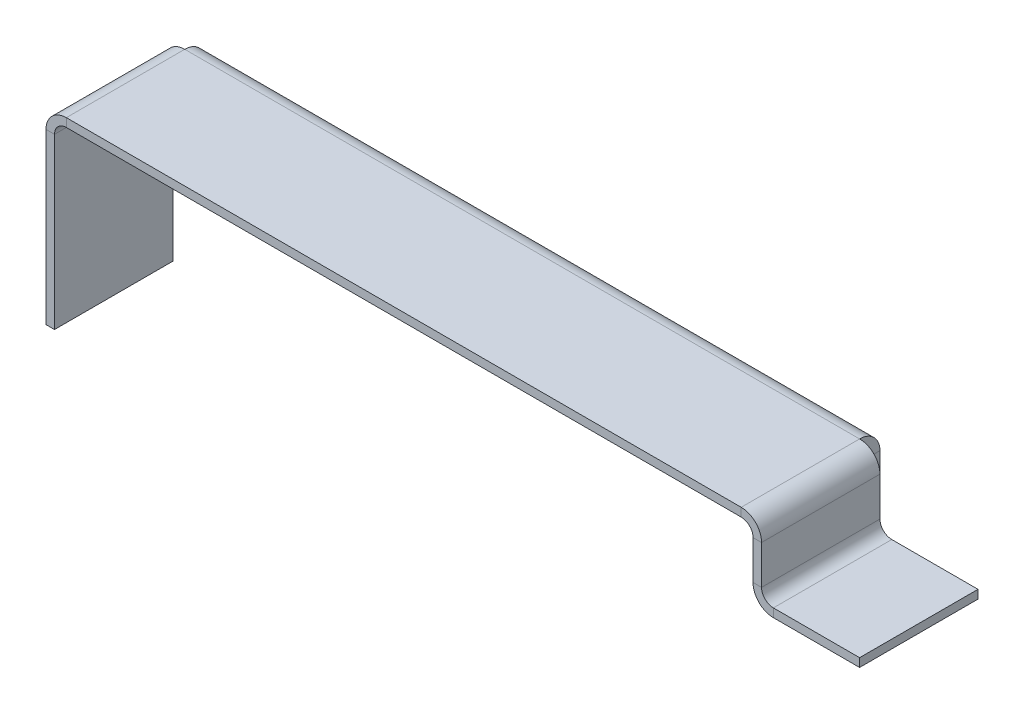
ISO-10303-21;
HEADER;
FILE_DESCRIPTION(('STEP AP214'),'2;1');
FILE_NAME('part.step','',(''),(''),'','','');
FILE_SCHEMA(('AUTOMOTIVE_DESIGN { 1 0 10303 214 1 1 1 1 }'));
ENDSEC;
DATA;
#1=APPLICATION_CONTEXT('core data for automotive mechanical design processes');
#2=APPLICATION_PROTOCOL_DEFINITION('international standard','automotive_design',2000,#1);
#3=PRODUCT_CONTEXT('',#1,'mechanical');
#4=PRODUCT('Part','Part','',(#3));
#5=PRODUCT_RELATED_PRODUCT_CATEGORY('part','',(#4));
#6=PRODUCT_DEFINITION_FORMATION('','',#4);
#7=PRODUCT_DEFINITION_CONTEXT('part definition',#1,'design');
#8=PRODUCT_DEFINITION('design','',#6,#7);
#9=PRODUCT_DEFINITION_SHAPE('','',#8);
#10=(LENGTH_UNIT() NAMED_UNIT(*) SI_UNIT(.MILLI.,.METRE.));
#11=(NAMED_UNIT(*) PLANE_ANGLE_UNIT() SI_UNIT($,.RADIAN.));
#12=(NAMED_UNIT(*) SI_UNIT($,.STERADIAN.) SOLID_ANGLE_UNIT());
#13=UNCERTAINTY_MEASURE_WITH_UNIT(LENGTH_MEASURE(1.E-05),#10,'distance_accuracy_value','');
#14=(GEOMETRIC_REPRESENTATION_CONTEXT(3) GLOBAL_UNCERTAINTY_ASSIGNED_CONTEXT((#13)) GLOBAL_UNIT_ASSIGNED_CONTEXT((#10,
#11,#12)) REPRESENTATION_CONTEXT('',''));
#15=CARTESIAN_POINT('',(0.,0.,0.));
#16=DIRECTION('',(0.,0.,1.));
#17=DIRECTION('',(1.,0.,0.));
#18=AXIS2_PLACEMENT_3D('',#15,#16,#17);
#19=CARTESIAN_POINT('',(0.,-0.91186,0.));
#20=DIRECTION('',(0.,0.,1.));
#21=DIRECTION('',(1.,0.,0.));
#22=AXIS2_PLACEMENT_3D('',#19,#20,#21);
#23=PLANE('',#22);
#24=DIRECTION('',(1.,0.,0.));
#25=VECTOR('',#24,1.);
#26=CARTESIAN_POINT('',(0.,0.,0.));
#27=LINE('',#26,#25);
#28=CARTESIAN_POINT('',(0.,0.,0.));
#29=VERTEX_POINT('',#28);
#30=CARTESIAN_POINT('',(72.39,0.,0.));
#31=VERTEX_POINT('',#30);
#32=EDGE_CURVE('E227',#29,#31,#27,.T.);
#33=ORIENTED_EDGE('',*,*,#32,.F.);
#34=DIRECTION('',(0.,1.,0.));
#35=VECTOR('',#34,1.);
#36=CARTESIAN_POINT('',(0.,-0.91186,0.));
#37=LINE('',#36,#35);
#38=CARTESIAN_POINT('',(0.,-0.91186,0.));
#39=VERTEX_POINT('',#38);
#40=EDGE_CURVE('E122',#39,#29,#37,.T.);
#41=ORIENTED_EDGE('',*,*,#40,.F.);
#42=DIRECTION('',(1.,0.,0.));
#43=VECTOR('',#42,1.);
#44=CARTESIAN_POINT('',(0.,-0.91186,0.));
#45=LINE('',#44,#43);
#46=CARTESIAN_POINT('',(72.39,-0.911860000000003,0.));
#47=VERTEX_POINT('',#46);
#48=EDGE_CURVE('E215',#39,#47,#45,.T.);
#49=ORIENTED_EDGE('',*,*,#48,.T.);
#50=DIRECTION('',(0.,1.,0.));
#51=VECTOR('',#50,1.);
#52=CARTESIAN_POINT('',(72.39,-0.91186,0.));
#53=LINE('',#52,#51);
#54=EDGE_CURVE('E236',#47,#31,#53,.T.);
#55=ORIENTED_EDGE('',*,*,#54,.T.);
#56=EDGE_LOOP('',(#33,#41,#49,#55));
#57=FACE_BOUND('',#56,.T.);
#58=ADVANCED_FACE('F119',(#57),#23,.T.);
#59=CARTESIAN_POINT('',(0.,-0.91186,0.));
#60=DIRECTION('',(0.,-1.,0.));
#61=DIRECTION('',(0.,0.,-1.));
#62=AXIS2_PLACEMENT_3D('',#59,#60,#61);
#63=PLANE('',#62);
#64=DIRECTION('',(0.,0.,1.));
#65=VECTOR('',#64,1.);
#66=CARTESIAN_POINT('',(0.,-0.91186,0.));
#67=LINE('',#66,#65);
#68=CARTESIAN_POINT('',(0.,-0.911859999999999,-12.7));
#69=VERTEX_POINT('',#68);
#70=EDGE_CURVE('E213',#69,#39,#67,.T.);
#71=ORIENTED_EDGE('',*,*,#70,.F.);
#72=DIRECTION('',(-1.,0.,0.));
#73=VECTOR('',#72,1.);
#74=CARTESIAN_POINT('',(0.,-0.91186,-12.7));
#75=LINE('',#74,#73);
#76=CARTESIAN_POINT('',(72.39,-0.911860000000011,-12.7));
#77=VERTEX_POINT('',#76);
#78=EDGE_CURVE('E222',#77,#69,#75,.T.);
#79=ORIENTED_EDGE('',*,*,#78,.F.);
#80=DIRECTION('',(0.,0.,-1.));
#81=VECTOR('',#80,1.);
#82=CARTESIAN_POINT('',(72.39,-0.91186,0.));
#83=LINE('',#82,#81);
#84=EDGE_CURVE('E219',#47,#77,#83,.T.);
#85=ORIENTED_EDGE('',*,*,#84,.F.);
#86=ORIENTED_EDGE('',*,*,#48,.F.);
#87=EDGE_LOOP('',(#71,#79,#85,#86));
#88=FACE_BOUND('',#87,.T.);
#89=ADVANCED_FACE('F523',(#88),#63,.T.);
#90=CARTESIAN_POINT('',(0.,0.,0.));
#91=DIRECTION('',(0.,-1.,0.));
#92=DIRECTION('',(0.,0.,-1.));
#93=AXIS2_PLACEMENT_3D('',#90,#91,#92);
#94=PLANE('',#93);
#95=DIRECTION('',(0.,0.,1.));
#96=VECTOR('',#95,1.);
#97=CARTESIAN_POINT('',(0.,0.,0.));
#98=LINE('',#97,#96);
#99=CARTESIAN_POINT('',(0.,0.,-12.7));
#100=VERTEX_POINT('',#99);
#101=EDGE_CURVE('E209',#100,#29,#98,.T.);
#102=ORIENTED_EDGE('',*,*,#101,.T.);
#103=ORIENTED_EDGE('',*,*,#32,.T.);
#104=DIRECTION('',(0.,0.,-1.));
#105=VECTOR('',#104,1.);
#106=CARTESIAN_POINT('',(72.39,0.,0.));
#107=LINE('',#106,#105);
#108=CARTESIAN_POINT('',(72.39,0.,-12.7));
#109=VERTEX_POINT('',#108);
#110=EDGE_CURVE('E230',#31,#109,#107,.T.);
#111=ORIENTED_EDGE('',*,*,#110,.T.);
#112=DIRECTION('',(-1.,0.,0.));
#113=VECTOR('',#112,1.);
#114=CARTESIAN_POINT('',(0.,0.,-12.7));
#115=LINE('',#114,#113);
#116=EDGE_CURVE('E216',#109,#100,#115,.T.);
#117=ORIENTED_EDGE('',*,*,#116,.T.);
#118=EDGE_LOOP('',(#102,#103,#111,#117));
#119=FACE_BOUND('',#118,.T.);
#120=ADVANCED_FACE('F247',(#119),#94,.F.);
#121=CARTESIAN_POINT('',(0.,-2.18186,0.));
#122=DIRECTION('',(0.,0.,1.));
#123=DIRECTION('',(1.,0.,0.));
#124=AXIS2_PLACEMENT_3D('',#121,#122,#123);
#125=PLANE('',#124);
#126=DIRECTION('',(-1.,0.,0.));
#127=VECTOR('',#126,1.);
#128=CARTESIAN_POINT('',(-2.18186,-2.18186,0.));
#129=LINE('',#128,#127);
#130=CARTESIAN_POINT('',(-1.27,-2.18186,0.));
#131=VERTEX_POINT('',#130);
#132=CARTESIAN_POINT('',(-2.18186,-2.18185999999999,0.));
#133=VERTEX_POINT('',#132);
#134=EDGE_CURVE('E173',#131,#133,#129,.T.);
#135=ORIENTED_EDGE('',*,*,#134,.F.);
#136=CARTESIAN_POINT('',(0.,-2.18186,0.));
#137=DIRECTION('',(0.,0.,-1.));
#138=DIRECTION('',(-1.,0.,0.));
#139=AXIS2_PLACEMENT_3D('',#136,#137,#138);
#140=CIRCLE('',#139,1.27);
#141=EDGE_CURVE('E167',#39,#131,#140,.F.);
#142=ORIENTED_EDGE('',*,*,#141,.F.);
#143=ORIENTED_EDGE('',*,*,#40,.T.);
#144=CARTESIAN_POINT('',(0.,-2.18186,0.));
#145=DIRECTION('',(0.,0.,-1.));
#146=DIRECTION('',(-1.,0.,0.));
#147=AXIS2_PLACEMENT_3D('',#144,#145,#146);
#148=CIRCLE('',#147,2.18186);
#149=EDGE_CURVE('E135',#29,#133,#148,.F.);
#150=ORIENTED_EDGE('',*,*,#149,.T.);
#151=EDGE_LOOP('',(#135,#142,#143,#150));
#152=FACE_BOUND('',#151,.T.);
#153=ADVANCED_FACE('F244',(#152),#125,.T.);
#154=CARTESIAN_POINT('',(0.,-2.18186,-12.7));
#155=DIRECTION('',(0.,0.,1.));
#156=DIRECTION('',(1.,0.,0.));
#157=AXIS2_PLACEMENT_3D('',#154,#155,#156);
#158=PLANE('',#157);
#159=CARTESIAN_POINT('',(0.,-2.18186,-12.7));
#160=DIRECTION('',(0.,0.,-1.));
#161=DIRECTION('',(-1.,0.,0.));
#162=AXIS2_PLACEMENT_3D('',#159,#160,#161);
#163=CIRCLE('',#162,1.27);
#164=CARTESIAN_POINT('',(-1.27,-2.18186,-12.7));
#165=VERTEX_POINT('',#164);
#166=EDGE_CURVE('E164',#165,#69,#163,.T.);
#167=ORIENTED_EDGE('',*,*,#166,.F.);
#168=DIRECTION('',(-1.,0.,0.));
#169=VECTOR('',#168,1.);
#170=CARTESIAN_POINT('',(-1.27,-2.18186,-12.7));
#171=LINE('',#170,#169);
#172=CARTESIAN_POINT('',(-2.18186,-2.18185999999999,-12.7));
#173=VERTEX_POINT('',#172);
#174=EDGE_CURVE('E172',#165,#173,#171,.T.);
#175=ORIENTED_EDGE('',*,*,#174,.T.);
#176=CARTESIAN_POINT('',(0.,-2.18186,-12.7));
#177=DIRECTION('',(0.,0.,-1.));
#178=DIRECTION('',(-1.,0.,0.));
#179=AXIS2_PLACEMENT_3D('',#176,#177,#178);
#180=CIRCLE('',#179,2.18186);
#181=EDGE_CURVE('E210',#173,#100,#180,.T.);
#182=ORIENTED_EDGE('',*,*,#181,.T.);
#183=DIRECTION('',(0.,1.,0.));
#184=VECTOR('',#183,1.);
#185=CARTESIAN_POINT('',(0.,-0.91186,-12.7));
#186=LINE('',#185,#184);
#187=EDGE_CURVE('E13',#69,#100,#186,.T.);
#188=ORIENTED_EDGE('',*,*,#187,.F.);
#189=EDGE_LOOP('',(#167,#175,#182,#188));
#190=FACE_BOUND('',#189,.T.);
#191=ADVANCED_FACE('F178',(#190),#158,.F.);
#192=CARTESIAN_POINT('',(0.,-2.18186,-12.7));
#193=DIRECTION('',(0.,0.,-1.));
#194=DIRECTION('',(-1.,0.,0.));
#195=AXIS2_PLACEMENT_3D('',#192,#193,#194);
#196=CYLINDRICAL_SURFACE('',#195,2.18186);
#197=ORIENTED_EDGE('',*,*,#101,.F.);
#198=ORIENTED_EDGE('',*,*,#181,.F.);
#199=DIRECTION('',(0.,0.,-1.));
#200=VECTOR('',#199,1.);
#201=CARTESIAN_POINT('',(-2.18186,-2.18185999999999,0.));
#202=LINE('',#201,#200);
#203=EDGE_CURVE('E199',#133,#173,#202,.T.);
#204=ORIENTED_EDGE('',*,*,#203,.F.);
#205=ORIENTED_EDGE('',*,*,#149,.F.);
#206=EDGE_LOOP('',(#197,#198,#204,#205));
#207=FACE_BOUND('',#206,.T.);
#208=ADVANCED_FACE('F249',(#207),#196,.T.);
#209=CARTESIAN_POINT('',(0.,-2.18186,-12.7));
#210=DIRECTION('',(0.,0.,-1.));
#211=DIRECTION('',(-1.,0.,0.));
#212=AXIS2_PLACEMENT_3D('',#209,#210,#211);
#213=CYLINDRICAL_SURFACE('',#212,1.27);
#214=ORIENTED_EDGE('',*,*,#70,.T.);
#215=ORIENTED_EDGE('',*,*,#141,.T.);
#216=DIRECTION('',(0.,0.,1.));
#217=VECTOR('',#216,1.);
#218=CARTESIAN_POINT('',(-1.27,-2.18186,0.));
#219=LINE('',#218,#217);
#220=EDGE_CURVE('E160',#131,#165,#219,.F.);
#221=ORIENTED_EDGE('',*,*,#220,.T.);
#222=ORIENTED_EDGE('',*,*,#166,.T.);
#223=EDGE_LOOP('',(#214,#215,#221,#222));
#224=FACE_BOUND('',#223,.T.);
#225=ADVANCED_FACE('F162',(#224),#213,.F.);
#226=CARTESIAN_POINT('',(-2.18186,-0.911859999999997,-12.7));
#227=DIRECTION('',(0.,0.,-1.));
#228=DIRECTION('',(-1.,0.,0.));
#229=AXIS2_PLACEMENT_3D('',#226,#227,#228);
#230=PLANE('',#229);
#231=DIRECTION('',(0.,1.,0.));
#232=VECTOR('',#231,1.);
#233=CARTESIAN_POINT('',(-2.18186,-0.911859999999997,-12.7));
#234=LINE('',#233,#232);
#235=CARTESIAN_POINT('',(-2.18186000000006,-20.32,-12.7));
#236=VERTEX_POINT('',#235);
#237=EDGE_CURVE('E198',#236,#173,#234,.T.);
#238=ORIENTED_EDGE('',*,*,#237,.T.);
#239=ORIENTED_EDGE('',*,*,#174,.F.);
#240=DIRECTION('',(0.,-1.,0.));
#241=VECTOR('',#240,1.);
#242=CARTESIAN_POINT('',(-1.26999999999999,0.,-12.7));
#243=LINE('',#242,#241);
#244=CARTESIAN_POINT('',(-1.27000000000006,-20.32,-12.7));
#245=VERTEX_POINT('',#244);
#246=EDGE_CURVE('E186',#245,#165,#243,.F.);
#247=ORIENTED_EDGE('',*,*,#246,.F.);
#248=DIRECTION('',(1.,0.,0.));
#249=VECTOR('',#248,1.);
#250=CARTESIAN_POINT('',(-2.18186000000006,-20.32,-12.7));
#251=LINE('',#250,#249);
#252=EDGE_CURVE('E182',#236,#245,#251,.T.);
#253=ORIENTED_EDGE('',*,*,#252,.F.);
#254=EDGE_LOOP('',(#238,#239,#247,#253));
#255=FACE_BOUND('',#254,.T.);
#256=ADVANCED_FACE('F196',(#255),#230,.T.);
#257=CARTESIAN_POINT('',(-2.18186000000006,-20.32,0.));
#258=DIRECTION('',(0.,0.,1.));
#259=DIRECTION('',(1.,0.,0.));
#260=AXIS2_PLACEMENT_3D('',#257,#258,#259);
#261=PLANE('',#260);
#262=DIRECTION('',(0.,1.,0.));
#263=VECTOR('',#262,1.);
#264=CARTESIAN_POINT('',(-1.26999999999999,0.,0.));
#265=LINE('',#264,#263);
#266=CARTESIAN_POINT('',(-1.27000000000006,-20.32,0.));
#267=VERTEX_POINT('',#266);
#268=EDGE_CURVE('E201',#131,#267,#265,.F.);
#269=ORIENTED_EDGE('',*,*,#268,.F.);
#270=ORIENTED_EDGE('',*,*,#134,.T.);
#271=DIRECTION('',(0.,-1.,0.));
#272=VECTOR('',#271,1.);
#273=CARTESIAN_POINT('',(-2.18186000000006,-20.32,0.));
#274=LINE('',#273,#272);
#275=CARTESIAN_POINT('',(-2.18186000000006,-20.32,0.));
#276=VERTEX_POINT('',#275);
#277=EDGE_CURVE('E193',#133,#276,#274,.T.);
#278=ORIENTED_EDGE('',*,*,#277,.T.);
#279=DIRECTION('',(1.,0.,0.));
#280=VECTOR('',#279,1.);
#281=CARTESIAN_POINT('',(-2.18186000000006,-20.32,0.));
#282=LINE('',#281,#280);
#283=EDGE_CURVE('E497',#276,#267,#282,.T.);
#284=ORIENTED_EDGE('',*,*,#283,.T.);
#285=EDGE_LOOP('',(#269,#270,#278,#284));
#286=FACE_BOUND('',#285,.T.);
#287=ADVANCED_FACE('F507',(#286),#261,.T.);
#288=CARTESIAN_POINT('',(-2.18185999999999,0.,0.));
#289=DIRECTION('',(-1.,0.,0.));
#290=DIRECTION('',(0.,-1.,0.));
#291=AXIS2_PLACEMENT_3D('',#288,#289,#290);
#292=PLANE('',#291);
#293=ORIENTED_EDGE('',*,*,#277,.F.);
#294=ORIENTED_EDGE('',*,*,#203,.T.);
#295=ORIENTED_EDGE('',*,*,#237,.F.);
#296=DIRECTION('',(0.,0.,-1.));
#297=VECTOR('',#296,1.);
#298=CARTESIAN_POINT('',(-2.18186000000006,-20.32,-12.7));
#299=LINE('',#298,#297);
#300=EDGE_CURVE('E500',#276,#236,#299,.T.);
#301=ORIENTED_EDGE('',*,*,#300,.F.);
#302=EDGE_LOOP('',(#293,#294,#295,#301));
#303=FACE_BOUND('',#302,.T.);
#304=ADVANCED_FACE('F512',(#303),#292,.T.);
#305=CARTESIAN_POINT('',(-1.26999999999999,0.,0.));
#306=DIRECTION('',(-1.,0.,0.));
#307=DIRECTION('',(0.,-1.,0.));
#308=AXIS2_PLACEMENT_3D('',#305,#306,#307);
#309=PLANE('',#308);
#310=ORIENTED_EDGE('',*,*,#220,.F.);
#311=ORIENTED_EDGE('',*,*,#268,.T.);
#312=DIRECTION('',(0.,0.,1.));
#313=VECTOR('',#312,1.);
#314=CARTESIAN_POINT('',(-1.27000000000006,-20.32,0.));
#315=LINE('',#314,#313);
#316=EDGE_CURVE('E190',#267,#245,#315,.F.);
#317=ORIENTED_EDGE('',*,*,#316,.T.);
#318=ORIENTED_EDGE('',*,*,#246,.T.);
#319=EDGE_LOOP('',(#310,#311,#317,#318));
#320=FACE_BOUND('',#319,.T.);
#321=ADVANCED_FACE('F187',(#320),#309,.F.);
#322=CARTESIAN_POINT('',(-2.18186000000006,-20.32,-12.7));
#323=DIRECTION('',(0.,-1.,0.));
#324=DIRECTION('',(1.,0.,0.));
#325=AXIS2_PLACEMENT_3D('',#322,#323,#324);
#326=PLANE('',#325);
#327=ORIENTED_EDGE('',*,*,#316,.F.);
#328=ORIENTED_EDGE('',*,*,#283,.F.);
#329=ORIENTED_EDGE('',*,*,#300,.T.);
#330=ORIENTED_EDGE('',*,*,#252,.T.);
#331=EDGE_LOOP('',(#327,#328,#329,#330));
#332=FACE_BOUND('',#331,.T.);
#333=ADVANCED_FACE('F511',(#332),#326,.T.);
#334=CARTESIAN_POINT('',(72.39,-2.18186,-12.7));
#335=DIRECTION('',(0.,0.,-1.));
#336=DIRECTION('',(-1.,0.,0.));
#337=AXIS2_PLACEMENT_3D('',#334,#335,#336);
#338=PLANE('',#337);
#339=DIRECTION('',(-1.,0.,0.));
#340=VECTOR('',#339,1.);
#341=CARTESIAN_POINT('',(74.57186,-2.18185999999999,-12.7));
#342=LINE('',#341,#340);
#343=CARTESIAN_POINT('',(73.66,-2.18185999999999,-12.7));
#344=VERTEX_POINT('',#343);
#345=CARTESIAN_POINT('',(74.57186,-2.18185999999999,-12.7));
#346=VERTEX_POINT('',#345);
#347=EDGE_CURVE('E282',#344,#346,#342,.F.);
#348=ORIENTED_EDGE('',*,*,#347,.F.);
#349=CARTESIAN_POINT('',(72.39,-2.18186,-12.7));
#350=DIRECTION('',(0.,0.,1.));
#351=DIRECTION('',(1.,0.,0.));
#352=AXIS2_PLACEMENT_3D('',#349,#350,#351);
#353=CIRCLE('',#352,1.26999999999999);
#354=EDGE_CURVE('E492',#77,#344,#353,.F.);
#355=ORIENTED_EDGE('',*,*,#354,.F.);
#356=DIRECTION('',(0.,1.,0.));
#357=VECTOR('',#356,1.);
#358=CARTESIAN_POINT('',(72.39,-0.91186,-12.7));
#359=LINE('',#358,#357);
#360=EDGE_CURVE('E127',#77,#109,#359,.T.);
#361=ORIENTED_EDGE('',*,*,#360,.T.);
#362=CARTESIAN_POINT('',(72.39,-2.18186,-12.7));
#363=DIRECTION('',(0.,0.,1.));
#364=DIRECTION('',(1.,0.,0.));
#365=AXIS2_PLACEMENT_3D('',#362,#363,#364);
#366=CIRCLE('',#365,2.18185999999999);
#367=EDGE_CURVE('E207',#109,#346,#366,.F.);
#368=ORIENTED_EDGE('',*,*,#367,.T.);
#369=EDGE_LOOP('',(#348,#355,#361,#368));
#370=FACE_BOUND('',#369,.T.);
#371=ADVANCED_FACE('F543',(#370),#338,.T.);
#372=CARTESIAN_POINT('',(72.39,-2.18186,0.));
#373=DIRECTION('',(0.,0.,-1.));
#374=DIRECTION('',(-1.,0.,0.));
#375=AXIS2_PLACEMENT_3D('',#372,#373,#374);
#376=PLANE('',#375);
#377=CARTESIAN_POINT('',(72.39,-2.18186,0.));
#378=DIRECTION('',(0.,0.,1.));
#379=DIRECTION('',(1.,0.,0.));
#380=AXIS2_PLACEMENT_3D('',#377,#378,#379);
#381=CIRCLE('',#380,1.26999999999999);
#382=CARTESIAN_POINT('',(73.66,-2.18185999999999,0.));
#383=VERTEX_POINT('',#382);
#384=EDGE_CURVE('E470',#383,#47,#381,.T.);
#385=ORIENTED_EDGE('',*,*,#384,.F.);
#386=DIRECTION('',(-1.,0.,0.));
#387=VECTOR('',#386,1.);
#388=CARTESIAN_POINT('',(73.66,-2.18185999999999,0.));
#389=LINE('',#388,#387);
#390=CARTESIAN_POINT('',(74.57186,-2.18185999999999,0.));
#391=VERTEX_POINT('',#390);
#392=EDGE_CURVE('E485',#383,#391,#389,.F.);
#393=ORIENTED_EDGE('',*,*,#392,.T.);
#394=CARTESIAN_POINT('',(72.39,-2.18186,0.));
#395=DIRECTION('',(0.,0.,1.));
#396=DIRECTION('',(1.,0.,0.));
#397=AXIS2_PLACEMENT_3D('',#394,#395,#396);
#398=CIRCLE('',#397,2.18185999999999);
#399=EDGE_CURVE('E303',#391,#31,#398,.T.);
#400=ORIENTED_EDGE('',*,*,#399,.T.);
#401=ORIENTED_EDGE('',*,*,#54,.F.);
#402=EDGE_LOOP('',(#385,#393,#400,#401));
#403=FACE_BOUND('',#402,.T.);
#404=ADVANCED_FACE('F587',(#403),#376,.F.);
#405=CARTESIAN_POINT('',(72.39,-2.18186,0.));
#406=DIRECTION('',(0.,0.,1.));
#407=DIRECTION('',(1.,0.,0.));
#408=AXIS2_PLACEMENT_3D('',#405,#406,#407);
#409=CYLINDRICAL_SURFACE('',#408,2.18185999999999);
#410=ORIENTED_EDGE('',*,*,#110,.F.);
#411=ORIENTED_EDGE('',*,*,#399,.F.);
#412=DIRECTION('',(0.,0.,1.));
#413=VECTOR('',#412,1.);
#414=CARTESIAN_POINT('',(74.57186,-2.18185999999999,-12.7));
#415=LINE('',#414,#413);
#416=EDGE_CURVE('E483',#391,#346,#415,.F.);
#417=ORIENTED_EDGE('',*,*,#416,.T.);
#418=ORIENTED_EDGE('',*,*,#367,.F.);
#419=EDGE_LOOP('',(#410,#411,#417,#418));
#420=FACE_BOUND('',#419,.T.);
#421=ADVANCED_FACE('F592',(#420),#409,.T.);
#422=CARTESIAN_POINT('',(72.39,-2.18186,0.));
#423=DIRECTION('',(0.,0.,1.));
#424=DIRECTION('',(1.,0.,0.));
#425=AXIS2_PLACEMENT_3D('',#422,#423,#424);
#426=CYLINDRICAL_SURFACE('',#425,1.26999999999999);
#427=ORIENTED_EDGE('',*,*,#84,.T.);
#428=ORIENTED_EDGE('',*,*,#354,.T.);
#429=DIRECTION('',(0.,0.,1.));
#430=VECTOR('',#429,1.);
#431=CARTESIAN_POINT('',(73.66,-2.18185999999999,-12.7));
#432=LINE('',#431,#430);
#433=EDGE_CURVE('E487',#344,#383,#432,.T.);
#434=ORIENTED_EDGE('',*,*,#433,.T.);
#435=ORIENTED_EDGE('',*,*,#384,.T.);
#436=EDGE_LOOP('',(#427,#428,#434,#435));
#437=FACE_BOUND('',#436,.T.);
#438=ADVANCED_FACE('F606',(#437),#426,.F.);
#439=CARTESIAN_POINT('',(74.57186,-6.35,0.));
#440=DIRECTION('',(0.,0.,-1.));
#441=DIRECTION('',(-1.,0.,0.));
#442=AXIS2_PLACEMENT_3D('',#439,#440,#441);
#443=PLANE('',#442);
#444=ORIENTED_EDGE('',*,*,#392,.F.);
#445=DIRECTION('',(0.,1.,0.));
#446=VECTOR('',#445,1.);
#447=CARTESIAN_POINT('',(73.66,-6.35,0.));
#448=LINE('',#447,#446);
#449=CARTESIAN_POINT('',(73.66,-6.35,0.));
#450=VERTEX_POINT('',#449);
#451=EDGE_CURVE('E481',#383,#450,#448,.F.);
#452=ORIENTED_EDGE('',*,*,#451,.T.);
#453=DIRECTION('',(-1.,0.,0.));
#454=VECTOR('',#453,1.);
#455=CARTESIAN_POINT('',(74.57186,-6.35,0.));
#456=LINE('',#455,#454);
#457=CARTESIAN_POINT('',(74.57186,-6.35,0.));
#458=VERTEX_POINT('',#457);
#459=EDGE_CURVE('E467',#458,#450,#456,.T.);
#460=ORIENTED_EDGE('',*,*,#459,.F.);
#461=DIRECTION('',(0.,-1.,0.));
#462=VECTOR('',#461,1.);
#463=CARTESIAN_POINT('',(74.57186,1.87918423407973E-13,0.));
#464=LINE('',#463,#462);
#465=EDGE_CURVE('E476',#391,#458,#464,.T.);
#466=ORIENTED_EDGE('',*,*,#465,.F.);
#467=EDGE_LOOP('',(#444,#452,#460,#466));
#468=FACE_BOUND('',#467,.T.);
#469=ADVANCED_FACE('F600',(#468),#443,.F.);
#470=CARTESIAN_POINT('',(74.57186,-0.911859999999997,-12.7));
#471=DIRECTION('',(0.,0.,1.));
#472=DIRECTION('',(1.,0.,0.));
#473=AXIS2_PLACEMENT_3D('',#470,#471,#472);
#474=PLANE('',#473);
#475=ORIENTED_EDGE('',*,*,#347,.T.);
#476=DIRECTION('',(0.,1.,0.));
#477=VECTOR('',#476,1.);
#478=CARTESIAN_POINT('',(74.57186,1.87918423407973E-13,-12.7));
#479=LINE('',#478,#477);
#480=CARTESIAN_POINT('',(74.57186,-6.35,-12.7));
#481=VERTEX_POINT('',#480);
#482=EDGE_CURVE('E473',#481,#346,#479,.T.);
#483=ORIENTED_EDGE('',*,*,#482,.F.);
#484=DIRECTION('',(-1.,0.,0.));
#485=VECTOR('',#484,1.);
#486=CARTESIAN_POINT('',(74.57186,-6.35,-12.7));
#487=LINE('',#486,#485);
#488=CARTESIAN_POINT('',(73.66,-6.35,-12.7));
#489=VERTEX_POINT('',#488);
#490=EDGE_CURVE('E471',#481,#489,#487,.T.);
#491=ORIENTED_EDGE('',*,*,#490,.T.);
#492=DIRECTION('',(0.,-1.,0.));
#493=VECTOR('',#492,1.);
#494=CARTESIAN_POINT('',(73.66,-0.911859999999999,-12.7));
#495=LINE('',#494,#493);
#496=EDGE_CURVE('E312',#489,#344,#495,.F.);
#497=ORIENTED_EDGE('',*,*,#496,.T.);
#498=EDGE_LOOP('',(#475,#483,#491,#497));
#499=FACE_BOUND('',#498,.T.);
#500=ADVANCED_FACE('F605',(#499),#474,.F.);
#501=CARTESIAN_POINT('',(74.57186,1.87918423407973E-13,0.));
#502=DIRECTION('',(-1.,0.,0.));
#503=DIRECTION('',(0.,-1.,0.));
#504=AXIS2_PLACEMENT_3D('',#501,#502,#503);
#505=PLANE('',#504);
#506=ORIENTED_EDGE('',*,*,#416,.F.);
#507=ORIENTED_EDGE('',*,*,#465,.T.);
#508=DIRECTION('',(0.,0.,-1.));
#509=VECTOR('',#508,1.);
#510=CARTESIAN_POINT('',(74.57186,-6.35,0.));
#511=LINE('',#510,#509);
#512=EDGE_CURVE('E292',#458,#481,#511,.T.);
#513=ORIENTED_EDGE('',*,*,#512,.T.);
#514=ORIENTED_EDGE('',*,*,#482,.T.);
#515=EDGE_LOOP('',(#506,#507,#513,#514));
#516=FACE_BOUND('',#515,.T.);
#517=ADVANCED_FACE('F619',(#516),#505,.F.);
#518=CARTESIAN_POINT('',(73.66,1.84734681234335E-13,0.));
#519=DIRECTION('',(-1.,0.,0.));
#520=DIRECTION('',(0.,-1.,0.));
#521=AXIS2_PLACEMENT_3D('',#518,#519,#520);
#522=PLANE('',#521);
#523=ORIENTED_EDGE('',*,*,#451,.F.);
#524=ORIENTED_EDGE('',*,*,#433,.F.);
#525=ORIENTED_EDGE('',*,*,#496,.F.);
#526=DIRECTION('',(0.,0.,1.));
#527=VECTOR('',#526,1.);
#528=CARTESIAN_POINT('',(73.66,-6.35,-12.7));
#529=LINE('',#528,#527);
#530=EDGE_CURVE('E479',#450,#489,#529,.F.);
#531=ORIENTED_EDGE('',*,*,#530,.F.);
#532=EDGE_LOOP('',(#523,#524,#525,#531));
#533=FACE_BOUND('',#532,.T.);
#534=ADVANCED_FACE('F630',(#533),#522,.T.);
#535=CARTESIAN_POINT('',(75.84186,-6.34999999999999,0.));
#536=DIRECTION('',(0.,0.,1.));
#537=DIRECTION('',(1.,0.,0.));
#538=AXIS2_PLACEMENT_3D('',#535,#536,#537);
#539=PLANE('',#538);
#540=DIRECTION('',(0.,1.,0.));
#541=VECTOR('',#540,1.);
#542=CARTESIAN_POINT('',(75.84186,-8.53186,0.));
#543=LINE('',#542,#541);
#544=CARTESIAN_POINT('',(75.84186,-7.62,0.));
#545=VERTEX_POINT('',#544);
#546=CARTESIAN_POINT('',(75.84186,-8.53185999999999,0.));
#547=VERTEX_POINT('',#546);
#548=EDGE_CURVE('E324',#545,#547,#543,.F.);
#549=ORIENTED_EDGE('',*,*,#548,.F.);
#550=CARTESIAN_POINT('',(75.84186,-6.34999999999999,0.));
#551=DIRECTION('',(0.,0.,-1.));
#552=DIRECTION('',(-1.,0.,0.));
#553=AXIS2_PLACEMENT_3D('',#550,#551,#552);
#554=CIRCLE('',#553,1.27);
#555=EDGE_CURVE('E463',#458,#545,#554,.F.);
#556=ORIENTED_EDGE('',*,*,#555,.F.);
#557=ORIENTED_EDGE('',*,*,#459,.T.);
#558=CARTESIAN_POINT('',(75.84186,-6.34999999999999,0.));
#559=DIRECTION('',(0.,0.,-1.));
#560=DIRECTION('',(-1.,0.,0.));
#561=AXIS2_PLACEMENT_3D('',#558,#559,#560);
#562=CIRCLE('',#561,2.18186);
#563=EDGE_CURVE('E460',#450,#547,#562,.F.);
#564=ORIENTED_EDGE('',*,*,#563,.T.);
#565=EDGE_LOOP('',(#549,#556,#557,#564));
#566=FACE_BOUND('',#565,.T.);
#567=ADVANCED_FACE('F640',(#566),#539,.T.);
#568=CARTESIAN_POINT('',(75.84186,-6.34999999999999,-12.7));
#569=DIRECTION('',(0.,0.,1.));
#570=DIRECTION('',(1.,0.,0.));
#571=AXIS2_PLACEMENT_3D('',#568,#569,#570);
#572=PLANE('',#571);
#573=CARTESIAN_POINT('',(75.84186,-6.34999999999999,-12.7));
#574=DIRECTION('',(0.,0.,-1.));
#575=DIRECTION('',(-1.,0.,0.));
#576=AXIS2_PLACEMENT_3D('',#573,#574,#575);
#577=CIRCLE('',#576,1.27);
#578=CARTESIAN_POINT('',(75.84186,-7.62,-12.7));
#579=VERTEX_POINT('',#578);
#580=EDGE_CURVE('E437',#579,#481,#577,.T.);
#581=ORIENTED_EDGE('',*,*,#580,.F.);
#582=DIRECTION('',(0.,1.,0.));
#583=VECTOR('',#582,1.);
#584=CARTESIAN_POINT('',(75.84186,-7.62,-12.7));
#585=LINE('',#584,#583);
#586=CARTESIAN_POINT('',(75.84186,-8.53186,-12.7));
#587=VERTEX_POINT('',#586);
#588=EDGE_CURVE('E455',#579,#587,#585,.F.);
#589=ORIENTED_EDGE('',*,*,#588,.T.);
#590=CARTESIAN_POINT('',(75.84186,-6.34999999999999,-12.7));
#591=DIRECTION('',(0.,0.,-1.));
#592=DIRECTION('',(-1.,0.,0.));
#593=AXIS2_PLACEMENT_3D('',#590,#591,#592);
#594=CIRCLE('',#593,2.18186);
#595=EDGE_CURVE('E352',#587,#489,#594,.T.);
#596=ORIENTED_EDGE('',*,*,#595,.T.);
#597=ORIENTED_EDGE('',*,*,#490,.F.);
#598=EDGE_LOOP('',(#581,#589,#596,#597));
#599=FACE_BOUND('',#598,.T.);
#600=ADVANCED_FACE('F650',(#599),#572,.F.);
#601=CARTESIAN_POINT('',(75.84186,-6.34999999999999,-12.7));
#602=DIRECTION('',(0.,0.,-1.));
#603=DIRECTION('',(0.,-1.,0.));
#604=AXIS2_PLACEMENT_3D('',#601,#602,#603);
#605=CYLINDRICAL_SURFACE('',#604,2.18186);
#606=ORIENTED_EDGE('',*,*,#530,.T.);
#607=ORIENTED_EDGE('',*,*,#595,.F.);
#608=DIRECTION('',(0.,0.,-1.));
#609=VECTOR('',#608,1.);
#610=CARTESIAN_POINT('',(75.84186,-8.53186,0.));
#611=LINE('',#610,#609);
#612=EDGE_CURVE('E453',#587,#547,#611,.F.);
#613=ORIENTED_EDGE('',*,*,#612,.T.);
#614=ORIENTED_EDGE('',*,*,#563,.F.);
#615=EDGE_LOOP('',(#606,#607,#613,#614));
#616=FACE_BOUND('',#615,.T.);
#617=ADVANCED_FACE('F660',(#616),#605,.T.);
#618=CARTESIAN_POINT('',(75.84186,-6.34999999999999,-12.7));
#619=DIRECTION('',(0.,0.,-1.));
#620=DIRECTION('',(0.,-1.,0.));
#621=AXIS2_PLACEMENT_3D('',#618,#619,#620);
#622=CYLINDRICAL_SURFACE('',#621,1.27);
#623=ORIENTED_EDGE('',*,*,#512,.F.);
#624=ORIENTED_EDGE('',*,*,#555,.T.);
#625=DIRECTION('',(0.,0.,-1.));
#626=VECTOR('',#625,1.);
#627=CARTESIAN_POINT('',(75.84186,-7.62,0.));
#628=LINE('',#627,#626);
#629=EDGE_CURVE('E457',#545,#579,#628,.T.);
#630=ORIENTED_EDGE('',*,*,#629,.T.);
#631=ORIENTED_EDGE('',*,*,#580,.T.);
#632=EDGE_LOOP('',(#623,#624,#630,#631));
#633=FACE_BOUND('',#632,.T.);
#634=ADVANCED_FACE('F671',(#633),#622,.F.);
#635=CARTESIAN_POINT('',(74.57186,-8.53185999999999,0.));
#636=DIRECTION('',(0.,0.,-1.));
#637=DIRECTION('',(-1.,0.,0.));
#638=AXIS2_PLACEMENT_3D('',#635,#636,#637);
#639=PLANE('',#638);
#640=ORIENTED_EDGE('',*,*,#548,.T.);
#641=DIRECTION('',(-1.,0.,0.));
#642=VECTOR('',#641,1.);
#643=CARTESIAN_POINT('',(0.,-8.53185999999993,0.));
#644=LINE('',#643,#642);
#645=CARTESIAN_POINT('',(85.09,-8.53186,0.));
#646=VERTEX_POINT('',#645);
#647=EDGE_CURVE('E444',#646,#547,#644,.T.);
#648=ORIENTED_EDGE('',*,*,#647,.F.);
#649=DIRECTION('',(0.,1.,0.));
#650=VECTOR('',#649,1.);
#651=CARTESIAN_POINT('',(85.09,-8.53186000000001,0.));
#652=LINE('',#651,#650);
#653=CARTESIAN_POINT('',(85.09,-7.62,0.));
#654=VERTEX_POINT('',#653);
#655=EDGE_CURVE('E438',#646,#654,#652,.T.);
#656=ORIENTED_EDGE('',*,*,#655,.T.);
#657=DIRECTION('',(1.,0.,0.));
#658=VECTOR('',#657,1.);
#659=CARTESIAN_POINT('',(74.57186,-7.61999999999999,0.));
#660=LINE('',#659,#658);
#661=EDGE_CURVE('E450',#654,#545,#660,.F.);
#662=ORIENTED_EDGE('',*,*,#661,.T.);
#663=EDGE_LOOP('',(#640,#648,#656,#662));
#664=FACE_BOUND('',#663,.T.);
#665=ADVANCED_FACE('F681',(#664),#639,.F.);
#666=CARTESIAN_POINT('',(85.09,-8.53186,-12.7));
#667=DIRECTION('',(0.,0.,1.));
#668=DIRECTION('',(1.,0.,0.));
#669=AXIS2_PLACEMENT_3D('',#666,#667,#668);
#670=PLANE('',#669);
#671=ORIENTED_EDGE('',*,*,#588,.F.);
#672=DIRECTION('',(-1.,0.,0.));
#673=VECTOR('',#672,1.);
#674=CARTESIAN_POINT('',(85.09,-7.62,-12.7));
#675=LINE('',#674,#673);
#676=CARTESIAN_POINT('',(85.09,-7.62,-12.7));
#677=VERTEX_POINT('',#676);
#678=EDGE_CURVE('E448',#579,#677,#675,.F.);
#679=ORIENTED_EDGE('',*,*,#678,.T.);
#680=DIRECTION('',(0.,1.,0.));
#681=VECTOR('',#680,1.);
#682=CARTESIAN_POINT('',(85.09,-8.53186,-12.7));
#683=LINE('',#682,#681);
#684=CARTESIAN_POINT('',(85.09,-8.53186,-12.7));
#685=VERTEX_POINT('',#684);
#686=EDGE_CURVE('E434',#685,#677,#683,.T.);
#687=ORIENTED_EDGE('',*,*,#686,.F.);
#688=DIRECTION('',(1.,0.,0.));
#689=VECTOR('',#688,1.);
#690=CARTESIAN_POINT('',(0.,-8.53185999999993,-12.7));
#691=LINE('',#690,#689);
#692=EDGE_CURVE('E442',#587,#685,#691,.T.);
#693=ORIENTED_EDGE('',*,*,#692,.F.);
#694=EDGE_LOOP('',(#671,#679,#687,#693));
#695=FACE_BOUND('',#694,.T.);
#696=ADVANCED_FACE('F692',(#695),#670,.F.);
#697=CARTESIAN_POINT('',(0.,-8.53185999999993,0.));
#698=DIRECTION('',(0.,1.,0.));
#699=DIRECTION('',(-1.,0.,0.));
#700=AXIS2_PLACEMENT_3D('',#697,#698,#699);
#701=PLANE('',#700);
#702=ORIENTED_EDGE('',*,*,#612,.F.);
#703=ORIENTED_EDGE('',*,*,#692,.T.);
#704=DIRECTION('',(0.,0.,1.));
#705=VECTOR('',#704,1.);
#706=CARTESIAN_POINT('',(85.09,-8.53186,0.));
#707=LINE('',#706,#705);
#708=EDGE_CURVE('E334',#685,#646,#707,.T.);
#709=ORIENTED_EDGE('',*,*,#708,.T.);
#710=ORIENTED_EDGE('',*,*,#647,.T.);
#711=EDGE_LOOP('',(#702,#703,#709,#710));
#712=FACE_BOUND('',#711,.T.);
#713=ADVANCED_FACE('F703',(#712),#701,.F.);
#714=CARTESIAN_POINT('',(0.,-7.61999999999993,0.));
#715=DIRECTION('',(0.,1.,0.));
#716=DIRECTION('',(-1.,0.,0.));
#717=AXIS2_PLACEMENT_3D('',#714,#715,#716);
#718=PLANE('',#717);
#719=ORIENTED_EDGE('',*,*,#678,.F.);
#720=ORIENTED_EDGE('',*,*,#629,.F.);
#721=ORIENTED_EDGE('',*,*,#661,.F.);
#722=DIRECTION('',(0.,0.,-1.));
#723=VECTOR('',#722,1.);
#724=CARTESIAN_POINT('',(85.09,-7.62,0.));
#725=LINE('',#724,#723);
#726=EDGE_CURVE('E446',#677,#654,#725,.F.);
#727=ORIENTED_EDGE('',*,*,#726,.F.);
#728=EDGE_LOOP('',(#719,#720,#721,#727));
#729=FACE_BOUND('',#728,.T.);
#730=ADVANCED_FACE('F714',(#729),#718,.T.);
#731=CARTESIAN_POINT('',(85.09,-8.53186,0.));
#732=DIRECTION('',(-1.,0.,0.));
#733=DIRECTION('',(0.,-1.,0.));
#734=AXIS2_PLACEMENT_3D('',#731,#732,#733);
#735=PLANE('',#734);
#736=ORIENTED_EDGE('',*,*,#726,.T.);
#737=ORIENTED_EDGE('',*,*,#655,.F.);
#738=ORIENTED_EDGE('',*,*,#708,.F.);
#739=ORIENTED_EDGE('',*,*,#686,.T.);
#740=EDGE_LOOP('',(#736,#737,#738,#739));
#741=FACE_BOUND('',#740,.T.);
#742=ADVANCED_FACE('F724',(#741),#735,.F.);
#743=CARTESIAN_POINT('',(0.,-2.18186,-12.7));
#744=DIRECTION('',(-1.,0.,0.));
#745=DIRECTION('',(0.,-1.,0.));
#746=AXIS2_PLACEMENT_3D('',#743,#744,#745);
#747=PLANE('',#746);
#748=DIRECTION('',(0.,0.,1.));
#749=VECTOR('',#748,1.);
#750=CARTESIAN_POINT('',(0.,-2.18185999999999,-14.88186));
#751=LINE('',#750,#749);
#752=CARTESIAN_POINT('',(0.,-2.18186,-13.97));
#753=VERTEX_POINT('',#752);
#754=CARTESIAN_POINT('',(0.,-2.18185999999999,-14.88186));
#755=VERTEX_POINT('',#754);
#756=EDGE_CURVE('E370',#753,#755,#751,.F.);
#757=ORIENTED_EDGE('',*,*,#756,.F.);
#758=CARTESIAN_POINT('',(0.,-2.18186,-12.7));
#759=DIRECTION('',(1.,0.,0.));
#760=DIRECTION('',(0.,1.,0.));
#761=AXIS2_PLACEMENT_3D('',#758,#759,#760);
#762=CIRCLE('',#761,1.27);
#763=EDGE_CURVE('E396',#69,#753,#762,.F.);
#764=ORIENTED_EDGE('',*,*,#763,.F.);
#765=ORIENTED_EDGE('',*,*,#187,.T.);
#766=CARTESIAN_POINT('',(0.,-2.18186,-12.7));
#767=DIRECTION('',(1.,0.,0.));
#768=DIRECTION('',(0.,1.,0.));
#769=AXIS2_PLACEMENT_3D('',#766,#767,#768);
#770=CIRCLE('',#769,2.18186);
#771=EDGE_CURVE('E144',#100,#755,#770,.F.);
#772=ORIENTED_EDGE('',*,*,#771,.T.);
#773=EDGE_LOOP('',(#757,#764,#765,#772));
#774=FACE_BOUND('',#773,.T.);
#775=ADVANCED_FACE('F734',(#774),#747,.T.);
#776=CARTESIAN_POINT('',(72.39,-2.18186000000001,-12.7));
#777=DIRECTION('',(-1.,0.,0.));
#778=DIRECTION('',(0.,-1.,0.));
#779=AXIS2_PLACEMENT_3D('',#776,#777,#778);
#780=PLANE('',#779);
#781=CARTESIAN_POINT('',(72.39,-2.18186000000001,-12.7));
#782=DIRECTION('',(1.,0.,0.));
#783=DIRECTION('',(0.,1.,0.));
#784=AXIS2_PLACEMENT_3D('',#781,#782,#783);
#785=CIRCLE('',#784,1.27);
#786=CARTESIAN_POINT('',(72.39,-2.18186000000001,-13.97));
#787=VERTEX_POINT('',#786);
#788=EDGE_CURVE('E403',#787,#77,#785,.T.);
#789=ORIENTED_EDGE('',*,*,#788,.F.);
#790=DIRECTION('',(0.,0.,1.));
#791=VECTOR('',#790,1.);
#792=CARTESIAN_POINT('',(72.39,-2.18186,-13.97));
#793=LINE('',#792,#791);
#794=CARTESIAN_POINT('',(72.39,-2.18185999999999,-14.88186));
#795=VERTEX_POINT('',#794);
#796=EDGE_CURVE('E400',#787,#795,#793,.F.);
#797=ORIENTED_EDGE('',*,*,#796,.T.);
#798=CARTESIAN_POINT('',(72.39,-2.18186000000001,-12.7));
#799=DIRECTION('',(1.,0.,0.));
#800=DIRECTION('',(0.,1.,0.));
#801=AXIS2_PLACEMENT_3D('',#798,#799,#800);
#802=CIRCLE('',#801,2.18186);
#803=EDGE_CURVE('E390',#795,#109,#802,.T.);
#804=ORIENTED_EDGE('',*,*,#803,.T.);
#805=ORIENTED_EDGE('',*,*,#360,.F.);
#806=EDGE_LOOP('',(#789,#797,#804,#805));
#807=FACE_BOUND('',#806,.T.);
#808=ADVANCED_FACE('F401',(#807),#780,.F.);
#809=CARTESIAN_POINT('',(72.39,-2.18186000000001,-12.7));
#810=DIRECTION('',(1.,0.,0.));
#811=DIRECTION('',(0.,0.,-1.));
#812=AXIS2_PLACEMENT_3D('',#809,#810,#811);
#813=CYLINDRICAL_SURFACE('',#812,2.18186);
#814=ORIENTED_EDGE('',*,*,#116,.F.);
#815=ORIENTED_EDGE('',*,*,#803,.F.);
#816=DIRECTION('',(1.,0.,0.));
#817=VECTOR('',#816,1.);
#818=CARTESIAN_POINT('',(0.,-2.18185999999999,-14.88186));
#819=LINE('',#818,#817);
#820=EDGE_CURVE('E394',#795,#755,#819,.F.);
#821=ORIENTED_EDGE('',*,*,#820,.T.);
#822=ORIENTED_EDGE('',*,*,#771,.F.);
#823=EDGE_LOOP('',(#814,#815,#821,#822));
#824=FACE_BOUND('',#823,.T.);
#825=ADVANCED_FACE('F392',(#824),#813,.T.);
#826=CARTESIAN_POINT('',(72.39,-2.18186000000001,-12.7));
#827=DIRECTION('',(1.,0.,0.));
#828=DIRECTION('',(0.,0.,-1.));
#829=AXIS2_PLACEMENT_3D('',#826,#827,#828);
#830=CYLINDRICAL_SURFACE('',#829,1.27);
#831=ORIENTED_EDGE('',*,*,#78,.T.);
#832=ORIENTED_EDGE('',*,*,#763,.T.);
#833=DIRECTION('',(1.,0.,0.));
#834=VECTOR('',#833,1.);
#835=CARTESIAN_POINT('',(0.,-2.18186,-13.97));
#836=LINE('',#835,#834);
#837=EDGE_CURVE('E407',#753,#787,#836,.T.);
#838=ORIENTED_EDGE('',*,*,#837,.T.);
#839=ORIENTED_EDGE('',*,*,#788,.T.);
#840=EDGE_LOOP('',(#831,#832,#838,#839));
#841=FACE_BOUND('',#840,.T.);
#842=ADVANCED_FACE('F817',(#841),#830,.F.);
#843=CARTESIAN_POINT('',(72.39,-6.35,-14.88186));
#844=DIRECTION('',(-1.,0.,0.));
#845=DIRECTION('',(0.,0.,1.));
#846=AXIS2_PLACEMENT_3D('',#843,#844,#845);
#847=PLANE('',#846);
#848=ORIENTED_EDGE('',*,*,#796,.F.);
#849=DIRECTION('',(0.,1.,0.));
#850=VECTOR('',#849,1.);
#851=CARTESIAN_POINT('',(72.39,-6.35000000000001,-13.97));
#852=LINE('',#851,#850);
#853=CARTESIAN_POINT('',(72.39,-6.35000000000001,-13.97));
#854=VERTEX_POINT('',#853);
#855=EDGE_CURVE('E414',#787,#854,#852,.F.);
#856=ORIENTED_EDGE('',*,*,#855,.T.);
#857=DIRECTION('',(0.,0.,1.));
#858=VECTOR('',#857,1.);
#859=CARTESIAN_POINT('',(72.39,-6.35,-14.88186));
#860=LINE('',#859,#858);
#861=CARTESIAN_POINT('',(72.39,-6.35,-14.88186));
#862=VERTEX_POINT('',#861);
#863=EDGE_CURVE('E418',#862,#854,#860,.T.);
#864=ORIENTED_EDGE('',*,*,#863,.F.);
#865=DIRECTION('',(0.,-1.,0.));
#866=VECTOR('',#865,1.);
#867=CARTESIAN_POINT('',(72.39,0.,-14.88186));
#868=LINE('',#867,#866);
#869=EDGE_CURVE('E410',#795,#862,#868,.T.);
#870=ORIENTED_EDGE('',*,*,#869,.F.);
#871=EDGE_LOOP('',(#848,#856,#864,#870));
#872=FACE_BOUND('',#871,.T.);
#873=ADVANCED_FACE('F416',(#872),#847,.F.);
#874=CARTESIAN_POINT('',(0.,-0.911859999999997,-14.88186));
#875=DIRECTION('',(1.,0.,0.));
#876=DIRECTION('',(0.,1.,0.));
#877=AXIS2_PLACEMENT_3D('',#874,#875,#876);
#878=PLANE('',#877);
#879=ORIENTED_EDGE('',*,*,#756,.T.);
#880=DIRECTION('',(0.,1.,0.));
#881=VECTOR('',#880,1.);
#882=CARTESIAN_POINT('',(0.,0.,-14.88186));
#883=LINE('',#882,#881);
#884=CARTESIAN_POINT('',(0.,-6.35,-14.88186));
#885=VERTEX_POINT('',#884);
#886=EDGE_CURVE('E413',#885,#755,#883,.T.);
#887=ORIENTED_EDGE('',*,*,#886,.F.);
#888=DIRECTION('',(0.,0.,1.));
#889=VECTOR('',#888,1.);
#890=CARTESIAN_POINT('',(0.,-6.35,-14.88186));
#891=LINE('',#890,#889);
#892=CARTESIAN_POINT('',(0.,-6.35,-13.97));
#893=VERTEX_POINT('',#892);
#894=EDGE_CURVE('E931',#885,#893,#891,.T.);
#895=ORIENTED_EDGE('',*,*,#894,.T.);
#896=DIRECTION('',(0.,-1.,0.));
#897=VECTOR('',#896,1.);
#898=CARTESIAN_POINT('',(0.,-0.91186,-13.97));
#899=LINE('',#898,#897);
#900=EDGE_CURVE('E419',#893,#753,#899,.F.);
#901=ORIENTED_EDGE('',*,*,#900,.T.);
#902=EDGE_LOOP('',(#879,#887,#895,#901));
#903=FACE_BOUND('',#902,.T.);
#904=ADVANCED_FACE('F837',(#903),#878,.F.);
#905=CARTESIAN_POINT('',(0.,0.,-14.88186));
#906=DIRECTION('',(0.,0.,1.));
#907=DIRECTION('',(0.,-1.,0.));
#908=AXIS2_PLACEMENT_3D('',#905,#906,#907);
#909=PLANE('',#908);
#910=ORIENTED_EDGE('',*,*,#820,.F.);
#911=ORIENTED_EDGE('',*,*,#869,.T.);
#912=DIRECTION('',(-1.,0.,0.));
#913=VECTOR('',#912,1.);
#914=CARTESIAN_POINT('',(0.,-6.35,-14.88186));
#915=LINE('',#914,#913);
#916=EDGE_CURVE('E380',#862,#885,#915,.T.);
#917=ORIENTED_EDGE('',*,*,#916,.T.);
#918=ORIENTED_EDGE('',*,*,#886,.T.);
#919=EDGE_LOOP('',(#910,#911,#917,#918));
#920=FACE_BOUND('',#919,.T.);
#921=ADVANCED_FACE('F409',(#920),#909,.F.);
#922=CARTESIAN_POINT('',(0.,0.,-13.97));
#923=DIRECTION('',(0.,0.,1.));
#924=DIRECTION('',(0.,-1.,0.));
#925=AXIS2_PLACEMENT_3D('',#922,#923,#924);
#926=PLANE('',#925);
#927=ORIENTED_EDGE('',*,*,#855,.F.);
#928=ORIENTED_EDGE('',*,*,#837,.F.);
#929=ORIENTED_EDGE('',*,*,#900,.F.);
#930=DIRECTION('',(1.,0.,0.));
#931=VECTOR('',#930,1.);
#932=CARTESIAN_POINT('',(0.,-6.35,-13.97));
#933=LINE('',#932,#931);
#934=EDGE_CURVE('E423',#854,#893,#933,.F.);
#935=ORIENTED_EDGE('',*,*,#934,.F.);
#936=EDGE_LOOP('',(#927,#928,#929,#935));
#937=FACE_BOUND('',#936,.T.);
#938=ADVANCED_FACE('F857',(#937),#926,.T.);
#939=CARTESIAN_POINT('',(0.,-6.35,-14.88186));
#940=DIRECTION('',(0.,1.,0.));
#941=DIRECTION('',(0.,0.,1.));
#942=AXIS2_PLACEMENT_3D('',#939,#940,#941);
#943=PLANE('',#942);
#944=ORIENTED_EDGE('',*,*,#934,.T.);
#945=ORIENTED_EDGE('',*,*,#894,.F.);
#946=ORIENTED_EDGE('',*,*,#916,.F.);
#947=ORIENTED_EDGE('',*,*,#863,.T.);
#948=EDGE_LOOP('',(#944,#945,#946,#947));
#949=FACE_BOUND('',#948,.T.);
#950=ADVANCED_FACE('F867',(#949),#943,.F.);
#951=CLOSED_SHELL('',(#58,#89,#120,#153,#191,#208,#225,#256,#287,#304,#321,#333,#371,#404,#421,
#438,#469,#500,#517,#534,#567,#600,#617,#634,#665,#696,#713,#730,#742,#775,#808,#825,#842,#873,
#904,#921,#938,#950));
#952=MANIFOLD_SOLID_BREP('B2',#951);
#953=ADVANCED_BREP_SHAPE_REPRESENTATION('',(#18,#952),#14);
#954=SHAPE_DEFINITION_REPRESENTATION(#9,#953);
ENDSEC;
END-ISO-10303-21;
